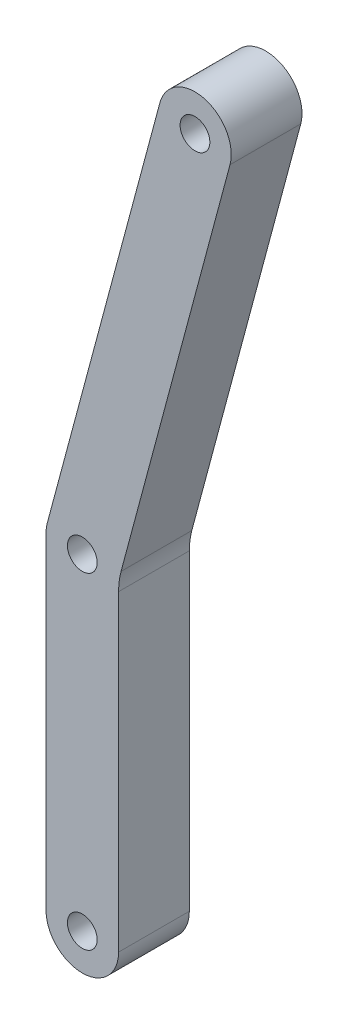
ISO-10303-21;
HEADER;
FILE_DESCRIPTION(('STEP AP214'),'2;1');
FILE_NAME('part.step','',(''),(''),'','','');
FILE_SCHEMA(('AUTOMOTIVE_DESIGN { 1 0 10303 214 1 1 1 1 }'));
ENDSEC;
DATA;
#1=APPLICATION_CONTEXT('core data for automotive mechanical design processes');
#2=APPLICATION_PROTOCOL_DEFINITION('international standard','automotive_design',2000,#1);
#3=PRODUCT_CONTEXT('',#1,'mechanical');
#4=PRODUCT('Part','Part','',(#3));
#5=PRODUCT_RELATED_PRODUCT_CATEGORY('part','',(#4));
#6=PRODUCT_DEFINITION_FORMATION('','',#4);
#7=PRODUCT_DEFINITION_CONTEXT('part definition',#1,'design');
#8=PRODUCT_DEFINITION('design','',#6,#7);
#9=PRODUCT_DEFINITION_SHAPE('','',#8);
#10=(LENGTH_UNIT() NAMED_UNIT(*) SI_UNIT(.MILLI.,.METRE.));
#11=(NAMED_UNIT(*) PLANE_ANGLE_UNIT() SI_UNIT($,.RADIAN.));
#12=(NAMED_UNIT(*) SI_UNIT($,.STERADIAN.) SOLID_ANGLE_UNIT());
#13=UNCERTAINTY_MEASURE_WITH_UNIT(LENGTH_MEASURE(1.E-05),#10,'distance_accuracy_value','');
#14=(GEOMETRIC_REPRESENTATION_CONTEXT(3) GLOBAL_UNCERTAINTY_ASSIGNED_CONTEXT((#13)) GLOBAL_UNIT_ASSIGNED_CONTEXT((#10,
#11,#12)) REPRESENTATION_CONTEXT('',''));
#15=CARTESIAN_POINT('',(0.,0.,0.));
#16=DIRECTION('',(0.,0.,1.));
#17=DIRECTION('',(1.,0.,0.));
#18=AXIS2_PLACEMENT_3D('',#15,#16,#17);
#19=CARTESIAN_POINT('',(-16.0796291314454,4.30852364036275,9.75));
#20=DIRECTION('',(-0.965925826289068,0.258819045102521,0.));
#21=DIRECTION('',(-0.258819045102521,-0.965925826289068,0.));
#22=AXIS2_PLACEMENT_3D('',#19,#20,#21);
#23=PLANE('',#22);
#24=DIRECTION('',(0.258819045102521,0.965925826289068,0.));
#25=VECTOR('',#24,1.);
#26=CARTESIAN_POINT('',(-16.0796291314454,4.30852364036275,0.));
#27=LINE('',#26,#25);
#28=CARTESIAN_POINT('',(-4.82962913144534,46.2940952255126,0.));
#29=VERTEX_POINT('',#28);
#30=CARTESIAN_POINT('',(10.6995135747059,104.249644802857,0.));
#31=VERTEX_POINT('',#30);
#32=EDGE_CURVE('E112',#29,#31,#27,.T.);
#33=ORIENTED_EDGE('',*,*,#32,.F.);
#34=DIRECTION('',(0.,0.,-1.));
#35=VECTOR('',#34,1.);
#36=CARTESIAN_POINT('',(-4.82962913144534,46.2940952255126,9.75));
#37=LINE('',#36,#35);
#38=CARTESIAN_POINT('',(-4.82962913144534,46.2940952255126,9.75));
#39=VERTEX_POINT('',#38);
#40=EDGE_CURVE('E107',#39,#29,#37,.T.);
#41=ORIENTED_EDGE('',*,*,#40,.F.);
#42=DIRECTION('',(0.258819045102521,0.965925826289068,0.));
#43=VECTOR('',#42,1.);
#44=CARTESIAN_POINT('',(-16.0796291314454,4.30852364036275,9.75));
#45=LINE('',#44,#43);
#46=CARTESIAN_POINT('',(10.6995135747059,104.249644802857,9.75));
#47=VERTEX_POINT('',#46);
#48=EDGE_CURVE('E110',#39,#47,#45,.T.);
#49=ORIENTED_EDGE('',*,*,#48,.T.);
#50=DIRECTION('',(0.,0.,-1.));
#51=VECTOR('',#50,1.);
#52=CARTESIAN_POINT('',(10.6995135747059,104.249644802857,9.75));
#53=LINE('',#52,#51);
#54=EDGE_CURVE('E167',#47,#31,#53,.T.);
#55=ORIENTED_EDGE('',*,*,#54,.T.);
#56=EDGE_LOOP('',(#33,#41,#49,#55));
#57=FACE_BOUND('',#56,.T.);
#58=ADVANCED_FACE('F41',(#57),#23,.T.);
#59=CARTESIAN_POINT('',(0.,45.,9.75));
#60=DIRECTION('',(0.,0.,-1.));
#61=DIRECTION('',(-1.,0.,0.));
#62=AXIS2_PLACEMENT_3D('',#59,#60,#61);
#63=CYLINDRICAL_SURFACE('',#62,5.);
#64=CARTESIAN_POINT('',(0.,45.,0.));
#65=DIRECTION('',(0.,0.,1.));
#66=DIRECTION('',(1.,0.,0.));
#67=AXIS2_PLACEMENT_3D('',#64,#65,#66);
#68=CIRCLE('',#67,5.);
#69=CARTESIAN_POINT('',(-5.,45.,0.));
#70=VERTEX_POINT('',#69);
#71=EDGE_CURVE('E170',#29,#70,#68,.T.);
#72=ORIENTED_EDGE('',*,*,#71,.T.);
#73=DIRECTION('',(0.,0.,-1.));
#74=VECTOR('',#73,1.);
#75=CARTESIAN_POINT('',(-5.,45.,9.75));
#76=LINE('',#75,#74);
#77=CARTESIAN_POINT('',(-5.,45.,9.75));
#78=VERTEX_POINT('',#77);
#79=EDGE_CURVE('E118',#78,#70,#76,.T.);
#80=ORIENTED_EDGE('',*,*,#79,.F.);
#81=CARTESIAN_POINT('',(0.,45.,9.75));
#82=DIRECTION('',(0.,0.,1.));
#83=DIRECTION('',(1.,0.,0.));
#84=AXIS2_PLACEMENT_3D('',#81,#82,#83);
#85=CIRCLE('',#84,5.);
#86=EDGE_CURVE('E121',#39,#78,#85,.T.);
#87=ORIENTED_EDGE('',*,*,#86,.F.);
#88=ORIENTED_EDGE('',*,*,#40,.T.);
#89=EDGE_LOOP('',(#72,#80,#87,#88));
#90=FACE_BOUND('',#89,.T.);
#91=ADVANCED_FACE('F122',(#90),#63,.T.);
#92=CARTESIAN_POINT('',(-5.,0.,9.75));
#93=DIRECTION('',(-1.,0.,0.));
#94=DIRECTION('',(0.,0.,1.));
#95=AXIS2_PLACEMENT_3D('',#92,#93,#94);
#96=PLANE('',#95);
#97=DIRECTION('',(0.,1.,0.));
#98=VECTOR('',#97,1.);
#99=CARTESIAN_POINT('',(-5.,0.,0.));
#100=LINE('',#99,#98);
#101=CARTESIAN_POINT('',(-5.,0.,0.));
#102=VERTEX_POINT('',#101);
#103=EDGE_CURVE('E173',#102,#70,#100,.T.);
#104=ORIENTED_EDGE('',*,*,#103,.F.);
#105=DIRECTION('',(0.,0.,-1.));
#106=VECTOR('',#105,1.);
#107=CARTESIAN_POINT('',(-5.,0.,9.75));
#108=LINE('',#107,#106);
#109=CARTESIAN_POINT('',(-5.,0.,9.75));
#110=VERTEX_POINT('',#109);
#111=EDGE_CURVE('E207',#110,#102,#108,.T.);
#112=ORIENTED_EDGE('',*,*,#111,.F.);
#113=DIRECTION('',(0.,1.,0.));
#114=VECTOR('',#113,1.);
#115=CARTESIAN_POINT('',(-5.,0.,9.75));
#116=LINE('',#115,#114);
#117=EDGE_CURVE('E127',#110,#78,#116,.T.);
#118=ORIENTED_EDGE('',*,*,#117,.T.);
#119=ORIENTED_EDGE('',*,*,#79,.T.);
#120=EDGE_LOOP('',(#104,#112,#118,#119));
#121=FACE_BOUND('',#120,.T.);
#122=ADVANCED_FACE('F247',(#121),#96,.T.);
#123=CARTESIAN_POINT('',(0.,0.,9.75));
#124=DIRECTION('',(0.,0.,-1.));
#125=DIRECTION('',(-1.,0.,0.));
#126=AXIS2_PLACEMENT_3D('',#123,#124,#125);
#127=CYLINDRICAL_SURFACE('',#126,5.);
#128=CARTESIAN_POINT('',(0.,0.,0.));
#129=DIRECTION('',(0.,0.,1.));
#130=DIRECTION('',(1.,0.,0.));
#131=AXIS2_PLACEMENT_3D('',#128,#129,#130);
#132=CIRCLE('',#131,5.);
#133=CARTESIAN_POINT('',(5.,0.,0.));
#134=VERTEX_POINT('',#133);
#135=EDGE_CURVE('E177',#102,#134,#132,.T.);
#136=ORIENTED_EDGE('',*,*,#135,.T.);
#137=DIRECTION('',(0.,0.,-1.));
#138=VECTOR('',#137,1.);
#139=CARTESIAN_POINT('',(5.,0.,9.75));
#140=LINE('',#139,#138);
#141=CARTESIAN_POINT('',(5.,0.,9.75));
#142=VERTEX_POINT('',#141);
#143=EDGE_CURVE('E203',#142,#134,#140,.T.);
#144=ORIENTED_EDGE('',*,*,#143,.F.);
#145=CARTESIAN_POINT('',(0.,0.,9.75));
#146=DIRECTION('',(0.,0.,1.));
#147=DIRECTION('',(1.,0.,0.));
#148=AXIS2_PLACEMENT_3D('',#145,#146,#147);
#149=CIRCLE('',#148,5.);
#150=EDGE_CURVE('E144',#110,#142,#149,.T.);
#151=ORIENTED_EDGE('',*,*,#150,.F.);
#152=ORIENTED_EDGE('',*,*,#111,.T.);
#153=EDGE_LOOP('',(#136,#144,#151,#152));
#154=FACE_BOUND('',#153,.T.);
#155=ADVANCED_FACE('F252',(#154),#127,.T.);
#156=CARTESIAN_POINT('',(5.,0.,9.75));
#157=DIRECTION('',(-1.,0.,0.));
#158=DIRECTION('',(0.,0.,1.));
#159=AXIS2_PLACEMENT_3D('',#156,#157,#158);
#160=PLANE('',#159);
#161=DIRECTION('',(0.,1.,0.));
#162=VECTOR('',#161,1.);
#163=CARTESIAN_POINT('',(5.,0.,0.));
#164=LINE('',#163,#162);
#165=CARTESIAN_POINT('',(5.,43.0252125361891,0.));
#166=VERTEX_POINT('',#165);
#167=EDGE_CURVE('E180',#134,#166,#164,.T.);
#168=ORIENTED_EDGE('',*,*,#167,.T.);
#169=DIRECTION('',(0.,0.,-1.));
#170=VECTOR('',#169,1.);
#171=CARTESIAN_POINT('',(5.,43.0252125361891,9.75));
#172=LINE('',#171,#170);
#173=CARTESIAN_POINT('',(5.,43.0252125361891,9.75));
#174=VERTEX_POINT('',#173);
#175=EDGE_CURVE('E57',#166,#174,#172,.F.);
#176=ORIENTED_EDGE('',*,*,#175,.T.);
#177=DIRECTION('',(0.,1.,0.));
#178=VECTOR('',#177,1.);
#179=CARTESIAN_POINT('',(5.,0.,9.75));
#180=LINE('',#179,#178);
#181=EDGE_CURVE('E147',#142,#174,#180,.T.);
#182=ORIENTED_EDGE('',*,*,#181,.F.);
#183=ORIENTED_EDGE('',*,*,#143,.T.);
#184=EDGE_LOOP('',(#168,#176,#182,#183));
#185=FACE_BOUND('',#184,.T.);
#186=ADVANCED_FACE('F256',(#185),#160,.F.);
#187=CARTESIAN_POINT('',(-6.42037086855468,1.72033318933754,9.75));
#188=DIRECTION('',(-0.965925826289068,0.258819045102521,0.));
#189=DIRECTION('',(-0.258819045102521,-0.965925826289068,0.));
#190=AXIS2_PLACEMENT_3D('',#187,#188,#189);
#191=PLANE('',#190);
#192=DIRECTION('',(0.258819045102521,0.965925826289068,0.));
#193=VECTOR('',#192,1.);
#194=CARTESIAN_POINT('',(-6.42037086855468,1.72033318933754,9.75));
#195=LINE('',#194,#193);
#196=CARTESIAN_POINT('',(5.34074173710932,45.6134029872143,9.75));
#197=VERTEX_POINT('',#196);
#198=CARTESIAN_POINT('',(20.3587718375966,101.661454351832,9.75));
#199=VERTEX_POINT('',#198);
#200=EDGE_CURVE('E150',#197,#199,#195,.T.);
#201=ORIENTED_EDGE('',*,*,#200,.F.);
#202=DIRECTION('',(0.,0.,-1.));
#203=VECTOR('',#202,1.);
#204=CARTESIAN_POINT('',(5.34074173710932,45.6134029872143,0.));
#205=LINE('',#204,#203);
#206=CARTESIAN_POINT('',(5.34074173710932,45.6134029872143,0.));
#207=VERTEX_POINT('',#206);
#208=EDGE_CURVE('E117',#197,#207,#205,.T.);
#209=ORIENTED_EDGE('',*,*,#208,.T.);
#210=DIRECTION('',(0.258819045102521,0.965925826289068,0.));
#211=VECTOR('',#210,1.);
#212=CARTESIAN_POINT('',(-6.42037086855468,1.72033318933754,0.));
#213=LINE('',#212,#211);
#214=CARTESIAN_POINT('',(20.3587718375966,101.661454351832,0.));
#215=VERTEX_POINT('',#214);
#216=EDGE_CURVE('E183',#207,#215,#213,.T.);
#217=ORIENTED_EDGE('',*,*,#216,.T.);
#218=DIRECTION('',(0.,0.,-1.));
#219=VECTOR('',#218,1.);
#220=CARTESIAN_POINT('',(20.3587718375966,101.661454351832,9.75));
#221=LINE('',#220,#219);
#222=EDGE_CURVE('E199',#199,#215,#221,.T.);
#223=ORIENTED_EDGE('',*,*,#222,.F.);
#224=EDGE_LOOP('',(#201,#209,#217,#223));
#225=FACE_BOUND('',#224,.T.);
#226=ADVANCED_FACE('F220',(#225),#191,.F.);
#227=CARTESIAN_POINT('',(0.,45.,9.75));
#228=DIRECTION('',(0.,0.,-1.));
#229=DIRECTION('',(-1.,0.,0.));
#230=AXIS2_PLACEMENT_3D('',#227,#228,#229);
#231=CYLINDRICAL_SURFACE('',#230,2.05);
#232=CARTESIAN_POINT('',(0.,45.,9.75));
#233=DIRECTION('',(0.,0.,1.));
#234=DIRECTION('',(1.,0.,0.));
#235=AXIS2_PLACEMENT_3D('',#232,#233,#234);
#236=CIRCLE('',#235,2.05);
#237=CARTESIAN_POINT('',(2.05,45.,9.75));
#238=VERTEX_POINT('',#237);
#239=EDGE_CURVE('E159',#238,#238,#236,.T.);
#240=ORIENTED_EDGE('',*,*,#239,.T.);
#241=EDGE_LOOP('',(#240));
#242=FACE_BOUND('',#241,.T.);
#243=CARTESIAN_POINT('',(0.,45.,0.));
#244=DIRECTION('',(0.,0.,1.));
#245=DIRECTION('',(1.,0.,0.));
#246=AXIS2_PLACEMENT_3D('',#243,#244,#245);
#247=CIRCLE('',#246,2.05);
#248=CARTESIAN_POINT('',(2.05,45.,0.));
#249=VERTEX_POINT('',#248);
#250=EDGE_CURVE('E139',#249,#249,#247,.T.);
#251=ORIENTED_EDGE('',*,*,#250,.F.);
#252=EDGE_LOOP('',(#251));
#253=FACE_BOUND('',#252,.T.);
#254=ADVANCED_FACE('F239',(#242,#253),#231,.F.);
#255=CARTESIAN_POINT('',(15.5291427061513,102.955549577344,9.75));
#256=DIRECTION('',(0.,0.,-1.));
#257=DIRECTION('',(-1.,0.,0.));
#258=AXIS2_PLACEMENT_3D('',#255,#256,#257);
#259=CYLINDRICAL_SURFACE('',#258,2.05);
#260=CARTESIAN_POINT('',(15.5291427061513,102.955549577344,9.75));
#261=DIRECTION('',(0.,0.,1.));
#262=DIRECTION('',(1.,0.,0.));
#263=AXIS2_PLACEMENT_3D('',#260,#261,#262);
#264=CIRCLE('',#263,2.05);
#265=CARTESIAN_POINT('',(17.5791427061513,102.955549577344,9.75));
#266=VERTEX_POINT('',#265);
#267=EDGE_CURVE('E155',#266,#266,#264,.T.);
#268=ORIENTED_EDGE('',*,*,#267,.T.);
#269=EDGE_LOOP('',(#268));
#270=FACE_BOUND('',#269,.T.);
#271=CARTESIAN_POINT('',(15.5291427061513,102.955549577344,0.));
#272=DIRECTION('',(0.,0.,1.));
#273=DIRECTION('',(1.,0.,0.));
#274=AXIS2_PLACEMENT_3D('',#271,#272,#273);
#275=CIRCLE('',#274,2.05);
#276=CARTESIAN_POINT('',(17.5791427061513,102.955549577344,0.));
#277=VERTEX_POINT('',#276);
#278=EDGE_CURVE('E190',#277,#277,#275,.T.);
#279=ORIENTED_EDGE('',*,*,#278,.F.);
#280=EDGE_LOOP('',(#279));
#281=FACE_BOUND('',#280,.T.);
#282=ADVANCED_FACE('F231',(#270,#281),#259,.F.);
#283=CARTESIAN_POINT('',(15.5291427061513,102.955549577344,9.75));
#284=DIRECTION('',(0.,0.,-1.));
#285=DIRECTION('',(-1.,0.,0.));
#286=AXIS2_PLACEMENT_3D('',#283,#284,#285);
#287=CYLINDRICAL_SURFACE('',#286,5.);
#288=CARTESIAN_POINT('',(15.5291427061513,102.955549577344,0.));
#289=DIRECTION('',(0.,0.,1.));
#290=DIRECTION('',(1.,0.,0.));
#291=AXIS2_PLACEMENT_3D('',#288,#289,#290);
#292=CIRCLE('',#291,5.);
#293=EDGE_CURVE('E186',#215,#31,#292,.T.);
#294=ORIENTED_EDGE('',*,*,#293,.T.);
#295=ORIENTED_EDGE('',*,*,#54,.F.);
#296=CARTESIAN_POINT('',(15.5291427061513,102.955549577344,9.75));
#297=DIRECTION('',(0.,0.,1.));
#298=DIRECTION('',(1.,0.,0.));
#299=AXIS2_PLACEMENT_3D('',#296,#297,#298);
#300=CIRCLE('',#299,5.);
#301=EDGE_CURVE('E132',#199,#47,#300,.T.);
#302=ORIENTED_EDGE('',*,*,#301,.F.);
#303=ORIENTED_EDGE('',*,*,#222,.T.);
#304=EDGE_LOOP('',(#294,#295,#302,#303));
#305=FACE_BOUND('',#304,.T.);
#306=ADVANCED_FACE('F228',(#305),#287,.T.);
#307=CARTESIAN_POINT('',(0.,0.,9.75));
#308=DIRECTION('',(0.,0.,-1.));
#309=DIRECTION('',(-1.,0.,0.));
#310=AXIS2_PLACEMENT_3D('',#307,#308,#309);
#311=CYLINDRICAL_SURFACE('',#310,2.05);
#312=CARTESIAN_POINT('',(0.,0.,9.75));
#313=DIRECTION('',(0.,0.,1.));
#314=DIRECTION('',(1.,0.,0.));
#315=AXIS2_PLACEMENT_3D('',#312,#313,#314);
#316=CIRCLE('',#315,2.05);
#317=CARTESIAN_POINT('',(2.05,0.,9.75));
#318=VERTEX_POINT('',#317);
#319=EDGE_CURVE('E163',#318,#318,#316,.T.);
#320=ORIENTED_EDGE('',*,*,#319,.T.);
#321=EDGE_LOOP('',(#320));
#322=FACE_BOUND('',#321,.T.);
#323=CARTESIAN_POINT('',(0.,0.,0.));
#324=DIRECTION('',(0.,0.,1.));
#325=DIRECTION('',(1.,0.,0.));
#326=AXIS2_PLACEMENT_3D('',#323,#324,#325);
#327=CIRCLE('',#326,2.05);
#328=CARTESIAN_POINT('',(2.05,0.,0.));
#329=VERTEX_POINT('',#328);
#330=EDGE_CURVE('E135',#329,#329,#327,.T.);
#331=ORIENTED_EDGE('',*,*,#330,.F.);
#332=EDGE_LOOP('',(#331));
#333=FACE_BOUND('',#332,.T.);
#334=ADVANCED_FACE('F230',(#322,#333),#311,.F.);
#335=CARTESIAN_POINT('',(0.,0.,9.75));
#336=DIRECTION('',(0.,0.,1.));
#337=DIRECTION('',(1.,0.,0.));
#338=AXIS2_PLACEMENT_3D('',#335,#336,#337);
#339=PLANE('',#338);
#340=ORIENTED_EDGE('',*,*,#48,.F.);
#341=ORIENTED_EDGE('',*,*,#86,.T.);
#342=ORIENTED_EDGE('',*,*,#117,.F.);
#343=ORIENTED_EDGE('',*,*,#150,.T.);
#344=ORIENTED_EDGE('',*,*,#181,.T.);
#345=CARTESIAN_POINT('',(15.,43.0252125361891,9.75));
#346=DIRECTION('',(0.,0.,1.));
#347=DIRECTION('',(1.,0.,0.));
#348=AXIS2_PLACEMENT_3D('',#345,#346,#347);
#349=CIRCLE('',#348,10.);
#350=EDGE_CURVE('E11',#174,#197,#349,.F.);
#351=ORIENTED_EDGE('',*,*,#350,.T.);
#352=ORIENTED_EDGE('',*,*,#200,.T.);
#353=ORIENTED_EDGE('',*,*,#301,.T.);
#354=EDGE_LOOP('',(#340,#341,#342,#343,#344,#351,#352,#353));
#355=FACE_BOUND('',#354,.T.);
#356=ORIENTED_EDGE('',*,*,#267,.F.);
#357=EDGE_LOOP('',(#356));
#358=FACE_BOUND('',#357,.T.);
#359=ORIENTED_EDGE('',*,*,#239,.F.);
#360=EDGE_LOOP('',(#359));
#361=FACE_BOUND('',#360,.T.);
#362=ORIENTED_EDGE('',*,*,#319,.F.);
#363=EDGE_LOOP('',(#362));
#364=FACE_BOUND('',#363,.T.);
#365=ADVANCED_FACE('F129',(#355,#358,#361,#364),#339,.T.);
#366=CARTESIAN_POINT('',(0.,0.,0.));
#367=DIRECTION('',(0.,0.,1.));
#368=DIRECTION('',(1.,0.,0.));
#369=AXIS2_PLACEMENT_3D('',#366,#367,#368);
#370=PLANE('',#369);
#371=ORIENTED_EDGE('',*,*,#32,.T.);
#372=ORIENTED_EDGE('',*,*,#293,.F.);
#373=ORIENTED_EDGE('',*,*,#216,.F.);
#374=CARTESIAN_POINT('',(15.,43.0252125361891,0.));
#375=DIRECTION('',(0.,0.,1.));
#376=DIRECTION('',(1.,0.,0.));
#377=AXIS2_PLACEMENT_3D('',#374,#375,#376);
#378=CIRCLE('',#377,10.);
#379=EDGE_CURVE('E50',#207,#166,#378,.T.);
#380=ORIENTED_EDGE('',*,*,#379,.T.);
#381=ORIENTED_EDGE('',*,*,#167,.F.);
#382=ORIENTED_EDGE('',*,*,#135,.F.);
#383=ORIENTED_EDGE('',*,*,#103,.T.);
#384=ORIENTED_EDGE('',*,*,#71,.F.);
#385=EDGE_LOOP('',(#371,#372,#373,#380,#381,#382,#383,#384));
#386=FACE_BOUND('',#385,.T.);
#387=ORIENTED_EDGE('',*,*,#278,.T.);
#388=EDGE_LOOP('',(#387));
#389=FACE_BOUND('',#388,.T.);
#390=ORIENTED_EDGE('',*,*,#250,.T.);
#391=EDGE_LOOP('',(#390));
#392=FACE_BOUND('',#391,.T.);
#393=ORIENTED_EDGE('',*,*,#330,.T.);
#394=EDGE_LOOP('',(#393));
#395=FACE_BOUND('',#394,.T.);
#396=ADVANCED_FACE('F225',(#386,#389,#392,#395),#370,.F.);
#397=CARTESIAN_POINT('',(15.,43.0252125361891,9.75));
#398=DIRECTION('',(0.,0.,1.));
#399=DIRECTION('',(1.,0.,0.));
#400=AXIS2_PLACEMENT_3D('',#397,#398,#399);
#401=CYLINDRICAL_SURFACE('',#400,10.);
#402=ORIENTED_EDGE('',*,*,#350,.F.);
#403=ORIENTED_EDGE('',*,*,#175,.F.);
#404=ORIENTED_EDGE('',*,*,#379,.F.);
#405=ORIENTED_EDGE('',*,*,#208,.F.);
#406=EDGE_LOOP('',(#402,#403,#404,#405));
#407=FACE_BOUND('',#406,.T.);
#408=ADVANCED_FACE('F43',(#407),#401,.F.);
#409=CLOSED_SHELL('',(#58,#91,#122,#155,#186,#226,#254,#282,#306,#334,#365,#396,#408));
#410=MANIFOLD_SOLID_BREP('B2',#409);
#411=ADVANCED_BREP_SHAPE_REPRESENTATION('',(#18,#410),#14);
#412=SHAPE_DEFINITION_REPRESENTATION(#9,#411);
ENDSEC;
END-ISO-10303-21;
